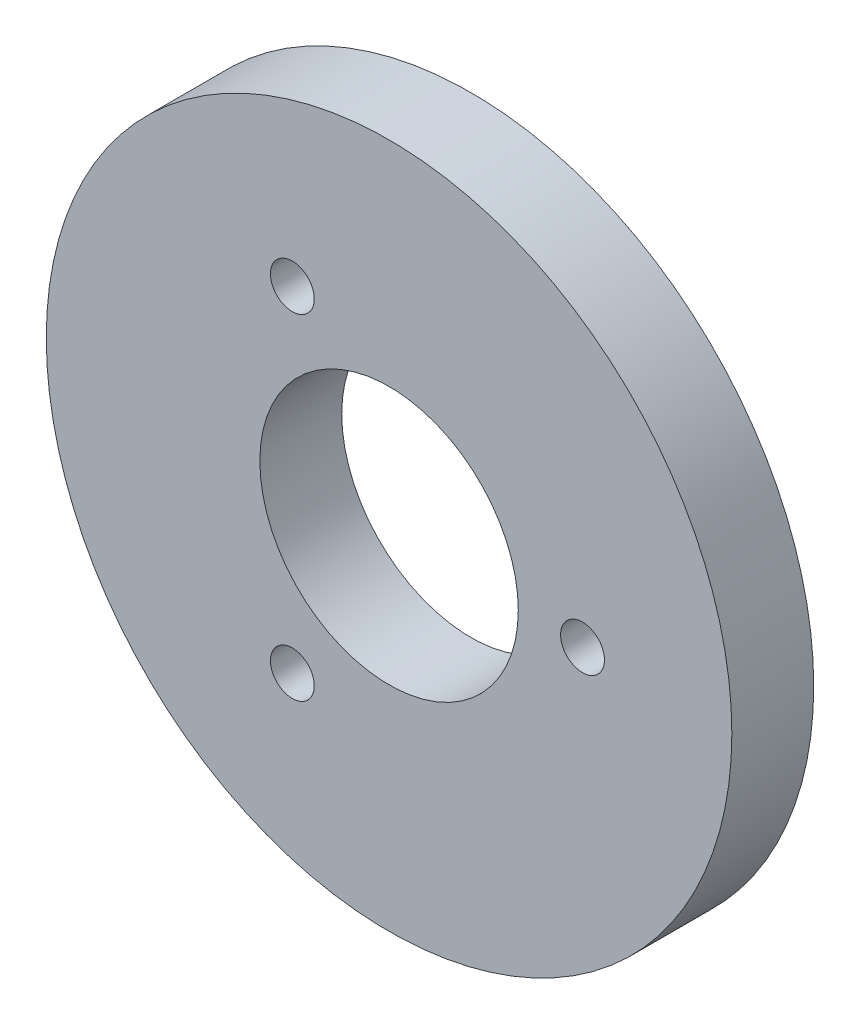
ISO-10303-21;
HEADER;
FILE_DESCRIPTION(('STEP AP214'),'2;1');
FILE_NAME('part.step','',(''),(''),'','','');
FILE_SCHEMA(('AUTOMOTIVE_DESIGN { 1 0 10303 214 1 1 1 1 }'));
ENDSEC;
DATA;
#1=APPLICATION_CONTEXT('core data for automotive mechanical design processes');
#2=APPLICATION_PROTOCOL_DEFINITION('international standard','automotive_design',2000,#1);
#3=PRODUCT_CONTEXT('',#1,'mechanical');
#4=PRODUCT('Part','Part','',(#3));
#5=PRODUCT_RELATED_PRODUCT_CATEGORY('part','',(#4));
#6=PRODUCT_DEFINITION_FORMATION('','',#4);
#7=PRODUCT_DEFINITION_CONTEXT('part definition',#1,'design');
#8=PRODUCT_DEFINITION('design','',#6,#7);
#9=PRODUCT_DEFINITION_SHAPE('','',#8);
#10=(LENGTH_UNIT() NAMED_UNIT(*) SI_UNIT(.MILLI.,.METRE.));
#11=(NAMED_UNIT(*) PLANE_ANGLE_UNIT() SI_UNIT($,.RADIAN.));
#12=(NAMED_UNIT(*) SI_UNIT($,.STERADIAN.) SOLID_ANGLE_UNIT());
#13=UNCERTAINTY_MEASURE_WITH_UNIT(LENGTH_MEASURE(1.E-05),#10,'distance_accuracy_value','');
#14=(GEOMETRIC_REPRESENTATION_CONTEXT(3) GLOBAL_UNCERTAINTY_ASSIGNED_CONTEXT((#13)) GLOBAL_UNIT_ASSIGNED_CONTEXT((#10,
#11,#12)) REPRESENTATION_CONTEXT('',''));
#15=CARTESIAN_POINT('',(0.,0.,0.));
#16=DIRECTION('',(0.,0.,1.));
#17=DIRECTION('',(1.,0.,0.));
#18=AXIS2_PLACEMENT_3D('',#15,#16,#17);
#19=CARTESIAN_POINT('',(107.857474429138,1.28231110120169,6.35));
#20=DIRECTION('',(0.,0.,1.));
#21=DIRECTION('',(1.,0.,0.));
#22=AXIS2_PLACEMENT_3D('',#19,#20,#21);
#23=PLANE('',#22);
#24=CARTESIAN_POINT('',(122.857474429138,1.28231110120169,6.35));
#25=DIRECTION('',(0.,0.,1.));
#26=DIRECTION('',(1.,0.,0.));
#27=AXIS2_PLACEMENT_3D('',#24,#25,#26);
#28=CIRCLE('',#27,1.69999999999998);
#29=CARTESIAN_POINT('',(124.557474429138,1.28231110120169,6.35));
#30=VERTEX_POINT('',#29);
#31=EDGE_CURVE('E53',#30,#30,#28,.T.);
#32=ORIENTED_EDGE('',*,*,#31,.F.);
#33=EDGE_LOOP('',(#32));
#34=FACE_BOUND('',#33,.T.);
#35=CARTESIAN_POINT('',(107.857474429138,1.28231110120169,6.35));
#36=DIRECTION('',(0.,0.,1.));
#37=DIRECTION('',(1.,0.,0.));
#38=AXIS2_PLACEMENT_3D('',#35,#36,#37);
#39=CIRCLE('',#38,10.0203);
#40=CARTESIAN_POINT('',(117.877774429139,1.28231110120169,6.35));
#41=VERTEX_POINT('',#40);
#42=EDGE_CURVE('E42',#41,#41,#39,.T.);
#43=ORIENTED_EDGE('',*,*,#42,.F.);
#44=EDGE_LOOP('',(#43));
#45=FACE_BOUND('',#44,.T.);
#46=CARTESIAN_POINT('',(107.857474429138,1.28231110120169,6.35));
#47=DIRECTION('',(0.,0.,1.));
#48=DIRECTION('',(1.,0.,0.));
#49=AXIS2_PLACEMENT_3D('',#46,#47,#48);
#50=CIRCLE('',#49,26.5811);
#51=CARTESIAN_POINT('',(134.438574429138,1.28231110120169,6.35));
#52=VERTEX_POINT('',#51);
#53=EDGE_CURVE('E10',#52,#52,#50,.T.);
#54=ORIENTED_EDGE('',*,*,#53,.T.);
#55=EDGE_LOOP('',(#54));
#56=FACE_BOUND('',#55,.T.);
#57=CARTESIAN_POINT('',(100.357474429139,-11.7080699555658,6.35));
#58=DIRECTION('',(0.,0.,1.));
#59=DIRECTION('',(1.,0.,0.));
#60=AXIS2_PLACEMENT_3D('',#57,#58,#59);
#61=CIRCLE('',#60,1.69999999999998);
#62=CARTESIAN_POINT('',(102.057474429139,-11.7080699555658,6.35));
#63=VERTEX_POINT('',#62);
#64=EDGE_CURVE('E47',#63,#63,#61,.T.);
#65=ORIENTED_EDGE('',*,*,#64,.F.);
#66=EDGE_LOOP('',(#65));
#67=FACE_BOUND('',#66,.T.);
#68=CARTESIAN_POINT('',(100.357474429138,14.2726921579673,6.35));
#69=DIRECTION('',(0.,0.,1.));
#70=DIRECTION('',(1.,0.,0.));
#71=AXIS2_PLACEMENT_3D('',#68,#69,#70);
#72=CIRCLE('',#71,1.69999999999998);
#73=CARTESIAN_POINT('',(102.057474429138,14.2726921579673,6.35));
#74=VERTEX_POINT('',#73);
#75=EDGE_CURVE('E59',#74,#74,#72,.T.);
#76=ORIENTED_EDGE('',*,*,#75,.F.);
#77=EDGE_LOOP('',(#76));
#78=FACE_BOUND('',#77,.T.);
#79=ADVANCED_FACE('F31',(#34,#45,#56,#67,#78),#23,.T.);
#80=CARTESIAN_POINT('',(107.857474429138,1.28231110120169,0.));
#81=DIRECTION('',(0.,0.,1.));
#82=DIRECTION('',(1.,0.,0.));
#83=AXIS2_PLACEMENT_3D('',#80,#81,#82);
#84=PLANE('',#83);
#85=CARTESIAN_POINT('',(122.857474429138,1.28231110120169,0.));
#86=DIRECTION('',(0.,0.,1.));
#87=DIRECTION('',(1.,0.,0.));
#88=AXIS2_PLACEMENT_3D('',#85,#86,#87);
#89=CIRCLE('',#88,1.69999999999998);
#90=CARTESIAN_POINT('',(124.557474429138,1.28231110120169,0.));
#91=VERTEX_POINT('',#90);
#92=EDGE_CURVE('E56',#91,#91,#89,.T.);
#93=ORIENTED_EDGE('',*,*,#92,.T.);
#94=EDGE_LOOP('',(#93));
#95=FACE_BOUND('',#94,.T.);
#96=CARTESIAN_POINT('',(107.857474429138,1.28231110120169,0.));
#97=DIRECTION('',(0.,0.,1.));
#98=DIRECTION('',(1.,0.,0.));
#99=AXIS2_PLACEMENT_3D('',#96,#97,#98);
#100=CIRCLE('',#99,10.0203);
#101=CARTESIAN_POINT('',(117.877774429139,1.28231110120169,0.));
#102=VERTEX_POINT('',#101);
#103=EDGE_CURVE('E44',#102,#102,#100,.T.);
#104=ORIENTED_EDGE('',*,*,#103,.T.);
#105=EDGE_LOOP('',(#104));
#106=FACE_BOUND('',#105,.T.);
#107=CARTESIAN_POINT('',(107.857474429138,1.28231110120169,0.));
#108=DIRECTION('',(0.,0.,1.));
#109=DIRECTION('',(1.,0.,0.));
#110=AXIS2_PLACEMENT_3D('',#107,#108,#109);
#111=CIRCLE('',#110,26.5811);
#112=CARTESIAN_POINT('',(134.438574429138,1.28231110120169,0.));
#113=VERTEX_POINT('',#112);
#114=EDGE_CURVE('E35',#113,#113,#111,.T.);
#115=ORIENTED_EDGE('',*,*,#114,.F.);
#116=EDGE_LOOP('',(#115));
#117=FACE_BOUND('',#116,.T.);
#118=CARTESIAN_POINT('',(100.357474429139,-11.7080699555658,0.));
#119=DIRECTION('',(0.,0.,1.));
#120=DIRECTION('',(1.,0.,0.));
#121=AXIS2_PLACEMENT_3D('',#118,#119,#120);
#122=CIRCLE('',#121,1.69999999999998);
#123=CARTESIAN_POINT('',(102.057474429139,-11.7080699555658,0.));
#124=VERTEX_POINT('',#123);
#125=EDGE_CURVE('E50',#124,#124,#122,.T.);
#126=ORIENTED_EDGE('',*,*,#125,.T.);
#127=EDGE_LOOP('',(#126));
#128=FACE_BOUND('',#127,.T.);
#129=CARTESIAN_POINT('',(100.357474429138,14.2726921579673,0.));
#130=DIRECTION('',(0.,0.,1.));
#131=DIRECTION('',(1.,0.,0.));
#132=AXIS2_PLACEMENT_3D('',#129,#130,#131);
#133=CIRCLE('',#132,1.69999999999998);
#134=CARTESIAN_POINT('',(102.057474429138,14.2726921579673,0.));
#135=VERTEX_POINT('',#134);
#136=EDGE_CURVE('E62',#135,#135,#133,.T.);
#137=ORIENTED_EDGE('',*,*,#136,.T.);
#138=EDGE_LOOP('',(#137));
#139=FACE_BOUND('',#138,.T.);
#140=ADVANCED_FACE('F72',(#95,#106,#117,#128,#139),#84,.F.);
#141=CARTESIAN_POINT('',(107.857474429138,1.28231110120169,6.35));
#142=DIRECTION('',(0.,0.,-1.));
#143=DIRECTION('',(-1.,0.,0.));
#144=AXIS2_PLACEMENT_3D('',#141,#142,#143);
#145=CYLINDRICAL_SURFACE('',#144,26.5811);
#146=ORIENTED_EDGE('',*,*,#53,.F.);
#147=EDGE_LOOP('',(#146));
#148=FACE_BOUND('',#147,.T.);
#149=ORIENTED_EDGE('',*,*,#114,.T.);
#150=EDGE_LOOP('',(#149));
#151=FACE_BOUND('',#150,.T.);
#152=ADVANCED_FACE('F33',(#148,#151),#145,.T.);
#153=CARTESIAN_POINT('',(107.857474429138,1.28231110120169,6.35));
#154=DIRECTION('',(0.,0.,-1.));
#155=DIRECTION('',(-1.,0.,0.));
#156=AXIS2_PLACEMENT_3D('',#153,#154,#155);
#157=CYLINDRICAL_SURFACE('',#156,10.0203);
#158=ORIENTED_EDGE('',*,*,#42,.T.);
#159=EDGE_LOOP('',(#158));
#160=FACE_BOUND('',#159,.T.);
#161=ORIENTED_EDGE('',*,*,#103,.F.);
#162=EDGE_LOOP('',(#161));
#163=FACE_BOUND('',#162,.T.);
#164=ADVANCED_FACE('F82',(#160,#163),#157,.F.);
#165=CARTESIAN_POINT('',(100.357474429139,-11.7080699555658,6.35));
#166=DIRECTION('',(0.,0.,-1.));
#167=DIRECTION('',(-1.,0.,0.));
#168=AXIS2_PLACEMENT_3D('',#165,#166,#167);
#169=CYLINDRICAL_SURFACE('',#168,1.69999999999998);
#170=ORIENTED_EDGE('',*,*,#64,.T.);
#171=EDGE_LOOP('',(#170));
#172=FACE_BOUND('',#171,.T.);
#173=ORIENTED_EDGE('',*,*,#125,.F.);
#174=EDGE_LOOP('',(#173));
#175=FACE_BOUND('',#174,.T.);
#176=ADVANCED_FACE('F85',(#172,#175),#169,.F.);
#177=CARTESIAN_POINT('',(122.857474429138,1.28231110120169,6.35));
#178=DIRECTION('',(0.,0.,-1.));
#179=DIRECTION('',(-1.,0.,0.));
#180=AXIS2_PLACEMENT_3D('',#177,#178,#179);
#181=CYLINDRICAL_SURFACE('',#180,1.69999999999998);
#182=ORIENTED_EDGE('',*,*,#31,.T.);
#183=EDGE_LOOP('',(#182));
#184=FACE_BOUND('',#183,.T.);
#185=ORIENTED_EDGE('',*,*,#92,.F.);
#186=EDGE_LOOP('',(#185));
#187=FACE_BOUND('',#186,.T.);
#188=ADVANCED_FACE('F89',(#184,#187),#181,.F.);
#189=CARTESIAN_POINT('',(100.357474429138,14.2726921579673,6.35));
#190=DIRECTION('',(0.,0.,-1.));
#191=DIRECTION('',(-1.,0.,0.));
#192=AXIS2_PLACEMENT_3D('',#189,#190,#191);
#193=CYLINDRICAL_SURFACE('',#192,1.69999999999998);
#194=ORIENTED_EDGE('',*,*,#75,.T.);
#195=EDGE_LOOP('',(#194));
#196=FACE_BOUND('',#195,.T.);
#197=ORIENTED_EDGE('',*,*,#136,.F.);
#198=EDGE_LOOP('',(#197));
#199=FACE_BOUND('',#198,.T.);
#200=ADVANCED_FACE('F68',(#196,#199),#193,.F.);
#201=CLOSED_SHELL('',(#79,#140,#152,#164,#176,#188,#200));
#202=MANIFOLD_SOLID_BREP('B2',#201);
#203=ADVANCED_BREP_SHAPE_REPRESENTATION('',(#18,#202),#14);
#204=SHAPE_DEFINITION_REPRESENTATION(#9,#203);
ENDSEC;
END-ISO-10303-21;
